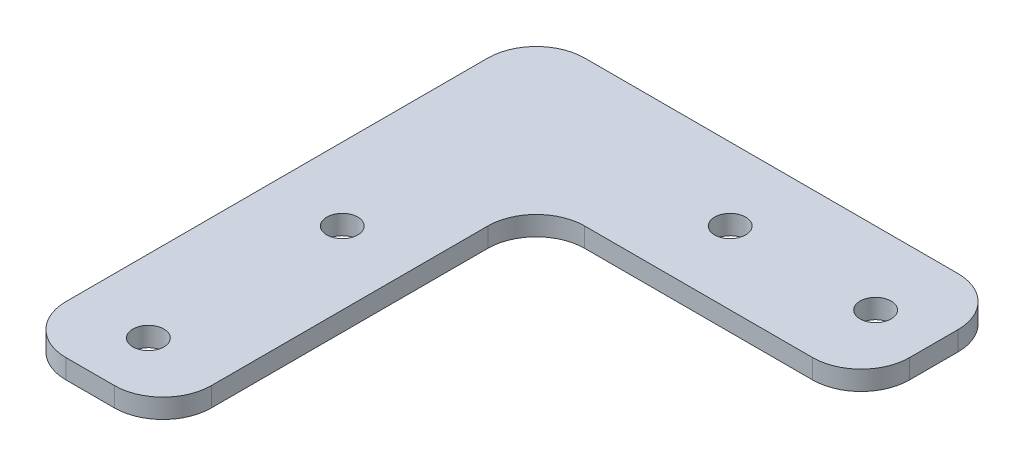
ISO-10303-21;
HEADER;
FILE_DESCRIPTION(('STEP AP214'),'2;1');
FILE_NAME('part.step','',(''),(''),'','','');
FILE_SCHEMA(('AUTOMOTIVE_DESIGN { 1 0 10303 214 1 1 1 1 }'));
ENDSEC;
DATA;
#1=APPLICATION_CONTEXT('core data for automotive mechanical design processes');
#2=APPLICATION_PROTOCOL_DEFINITION('international standard','automotive_design',2000,#1);
#3=PRODUCT_CONTEXT('',#1,'mechanical');
#4=PRODUCT('Part','Part','',(#3));
#5=PRODUCT_RELATED_PRODUCT_CATEGORY('part','',(#4));
#6=PRODUCT_DEFINITION_FORMATION('','',#4);
#7=PRODUCT_DEFINITION_CONTEXT('part definition',#1,'design');
#8=PRODUCT_DEFINITION('design','',#6,#7);
#9=PRODUCT_DEFINITION_SHAPE('','',#8);
#10=(LENGTH_UNIT() NAMED_UNIT(*) SI_UNIT(.MILLI.,.METRE.));
#11=(NAMED_UNIT(*) PLANE_ANGLE_UNIT() SI_UNIT($,.RADIAN.));
#12=(NAMED_UNIT(*) SI_UNIT($,.STERADIAN.) SOLID_ANGLE_UNIT());
#13=UNCERTAINTY_MEASURE_WITH_UNIT(LENGTH_MEASURE(1.E-05),#10,'distance_accuracy_value','');
#14=(GEOMETRIC_REPRESENTATION_CONTEXT(3) GLOBAL_UNCERTAINTY_ASSIGNED_CONTEXT((#13)) GLOBAL_UNIT_ASSIGNED_CONTEXT((#10,
#11,#12)) REPRESENTATION_CONTEXT('',''));
#15=CARTESIAN_POINT('',(0.,0.,0.));
#16=DIRECTION('',(0.,0.,1.));
#17=DIRECTION('',(1.,0.,0.));
#18=AXIS2_PLACEMENT_3D('',#15,#16,#17);
#19=CARTESIAN_POINT('',(0.,2.,0.));
#20=DIRECTION('',(0.,1.,0.));
#21=DIRECTION('',(0.,0.,1.));
#22=AXIS2_PLACEMENT_3D('',#19,#20,#21);
#23=PLANE('',#22);
#24=CARTESIAN_POINT('',(20.,2.,2.15105711021124E-13));
#25=DIRECTION('',(0.,1.,0.));
#26=DIRECTION('',(0.,0.,-1.));
#27=AXIS2_PLACEMENT_3D('',#24,#25,#26);
#28=CIRCLE('',#27,1.6);
#29=CARTESIAN_POINT('',(20.,2.,-1.59999999999979));
#30=VERTEX_POINT('',#29);
#31=EDGE_CURVE('E318',#30,#30,#28,.T.);
#32=ORIENTED_EDGE('',*,*,#31,.F.);
#33=EDGE_LOOP('',(#32));
#34=FACE_BOUND('',#33,.T.);
#35=CARTESIAN_POINT('',(0.,2.,40.));
#36=DIRECTION('',(0.,1.,0.));
#37=DIRECTION('',(0.,0.,1.));
#38=AXIS2_PLACEMENT_3D('',#35,#36,#37);
#39=CIRCLE('',#38,1.6);
#40=CARTESIAN_POINT('',(0.,2.,41.6));
#41=VERTEX_POINT('',#40);
#42=EDGE_CURVE('E292',#41,#41,#39,.T.);
#43=ORIENTED_EDGE('',*,*,#42,.F.);
#44=EDGE_LOOP('',(#43));
#45=FACE_BOUND('',#44,.T.);
#46=DIRECTION('',(1.,0.,0.));
#47=VECTOR('',#46,1.);
#48=CARTESIAN_POINT('',(7.5,2.,46.));
#49=LINE('',#48,#47);
#50=CARTESIAN_POINT('',(-2.5,2.,46.));
#51=VERTEX_POINT('',#50);
#52=CARTESIAN_POINT('',(2.5,2.,46.));
#53=VERTEX_POINT('',#52);
#54=EDGE_CURVE('E253',#51,#53,#49,.T.);
#55=ORIENTED_EDGE('',*,*,#54,.T.);
#56=CARTESIAN_POINT('',(2.5,2.,41.));
#57=DIRECTION('',(0.,1.,0.));
#58=DIRECTION('',(0.,0.,1.));
#59=AXIS2_PLACEMENT_3D('',#56,#57,#58);
#60=CIRCLE('',#59,5.);
#61=CARTESIAN_POINT('',(7.5,2.,41.));
#62=VERTEX_POINT('',#61);
#63=EDGE_CURVE('E212',#53,#62,#60,.T.);
#64=ORIENTED_EDGE('',*,*,#63,.T.);
#65=DIRECTION('',(0.,0.,-1.));
#66=VECTOR('',#65,1.);
#67=CARTESIAN_POINT('',(7.5,2.,7.50000000000007));
#68=LINE('',#67,#66);
#69=CARTESIAN_POINT('',(7.5,2.,12.5));
#70=VERTEX_POINT('',#69);
#71=EDGE_CURVE('E159',#62,#70,#68,.T.);
#72=ORIENTED_EDGE('',*,*,#71,.T.);
#73=CARTESIAN_POINT('',(12.5,2.,12.5));
#74=DIRECTION('',(0.,1.,0.));
#75=DIRECTION('',(0.,0.,1.));
#76=AXIS2_PLACEMENT_3D('',#73,#74,#75);
#77=CIRCLE('',#76,5.);
#78=CARTESIAN_POINT('',(12.5,2.,7.50000000000005));
#79=VERTEX_POINT('',#78);
#80=EDGE_CURVE('E11',#70,#79,#77,.F.);
#81=ORIENTED_EDGE('',*,*,#80,.T.);
#82=DIRECTION('',(1.,0.,0.));
#83=VECTOR('',#82,1.);
#84=CARTESIAN_POINT('',(7.5,2.,7.50000000000007));
#85=LINE('',#84,#83);
#86=CARTESIAN_POINT('',(36.,2.,7.49999999999994));
#87=VERTEX_POINT('',#86);
#88=EDGE_CURVE('E168',#79,#87,#85,.T.);
#89=ORIENTED_EDGE('',*,*,#88,.T.);
#90=CARTESIAN_POINT('',(36.,2.,2.49999999999994));
#91=DIRECTION('',(0.,1.,0.));
#92=DIRECTION('',(0.,0.,1.));
#93=AXIS2_PLACEMENT_3D('',#90,#91,#92);
#94=CIRCLE('',#93,5.);
#95=CARTESIAN_POINT('',(41.,2.,2.49999999999994));
#96=VERTEX_POINT('',#95);
#97=EDGE_CURVE('E201',#87,#96,#94,.T.);
#98=ORIENTED_EDGE('',*,*,#97,.T.);
#99=DIRECTION('',(0.,0.,-1.));
#100=VECTOR('',#99,1.);
#101=CARTESIAN_POINT('',(41.,2.,7.49999999999992));
#102=LINE('',#101,#100);
#103=CARTESIAN_POINT('',(41.,2.,-2.50000000000009));
#104=VERTEX_POINT('',#103);
#105=EDGE_CURVE('E177',#96,#104,#102,.T.);
#106=ORIENTED_EDGE('',*,*,#105,.T.);
#107=CARTESIAN_POINT('',(36.,2.,-2.50000000000008));
#108=DIRECTION('',(0.,1.,0.));
#109=DIRECTION('',(0.,0.,1.));
#110=AXIS2_PLACEMENT_3D('',#107,#108,#109);
#111=CIRCLE('',#110,5.);
#112=CARTESIAN_POINT('',(36.,2.,-7.50000000000008));
#113=VERTEX_POINT('',#112);
#114=EDGE_CURVE('E204',#104,#113,#111,.T.);
#115=ORIENTED_EDGE('',*,*,#114,.T.);
#116=DIRECTION('',(-1.,0.,0.));
#117=VECTOR('',#116,1.);
#118=CARTESIAN_POINT('',(41.,2.,-7.50000000000008));
#119=LINE('',#118,#117);
#120=CARTESIAN_POINT('',(-2.5,2.,-7.50000000000008));
#121=VERTEX_POINT('',#120);
#122=EDGE_CURVE('E262',#113,#121,#119,.T.);
#123=ORIENTED_EDGE('',*,*,#122,.T.);
#124=CARTESIAN_POINT('',(-2.5,2.,-2.50000000000008));
#125=DIRECTION('',(0.,1.,0.));
#126=DIRECTION('',(0.,0.,1.));
#127=AXIS2_PLACEMENT_3D('',#124,#125,#126);
#128=CIRCLE('',#127,5.);
#129=CARTESIAN_POINT('',(-7.5,2.,-2.50000000000008));
#130=VERTEX_POINT('',#129);
#131=EDGE_CURVE('E70',#121,#130,#128,.T.);
#132=ORIENTED_EDGE('',*,*,#131,.T.);
#133=DIRECTION('',(0.,0.,1.));
#134=VECTOR('',#133,1.);
#135=CARTESIAN_POINT('',(-7.5,2.,46.));
#136=LINE('',#135,#134);
#137=CARTESIAN_POINT('',(-7.5,2.,41.));
#138=VERTEX_POINT('',#137);
#139=EDGE_CURVE('E258',#130,#138,#136,.T.);
#140=ORIENTED_EDGE('',*,*,#139,.T.);
#141=CARTESIAN_POINT('',(-2.5,2.,41.));
#142=DIRECTION('',(0.,1.,0.));
#143=DIRECTION('',(0.,0.,1.));
#144=AXIS2_PLACEMENT_3D('',#141,#142,#143);
#145=CIRCLE('',#144,5.);
#146=EDGE_CURVE('E209',#138,#51,#145,.T.);
#147=ORIENTED_EDGE('',*,*,#146,.T.);
#148=EDGE_LOOP('',(#55,#64,#72,#81,#89,#98,#106,#115,#123,#132,#140,#147));
#149=FACE_BOUND('',#148,.T.);
#150=CARTESIAN_POINT('',(0.,2.,20.));
#151=DIRECTION('',(0.,1.,0.));
#152=DIRECTION('',(0.,0.,1.));
#153=AXIS2_PLACEMENT_3D('',#150,#151,#152);
#154=CIRCLE('',#153,1.6);
#155=CARTESIAN_POINT('',(0.,2.,21.6));
#156=VERTEX_POINT('',#155);
#157=EDGE_CURVE('E304',#156,#156,#154,.T.);
#158=ORIENTED_EDGE('',*,*,#157,.F.);
#159=EDGE_LOOP('',(#158));
#160=FACE_BOUND('',#159,.T.);
#161=CARTESIAN_POINT('',(35.,2.,1.83880688453542E-13));
#162=DIRECTION('',(0.,1.,0.));
#163=DIRECTION('',(0.,0.,-1.));
#164=AXIS2_PLACEMENT_3D('',#161,#162,#163);
#165=CIRCLE('',#164,1.6);
#166=CARTESIAN_POINT('',(35.,2.,-1.59999999999981));
#167=VERTEX_POINT('',#166);
#168=EDGE_CURVE('E328',#167,#167,#165,.T.);
#169=ORIENTED_EDGE('',*,*,#168,.F.);
#170=EDGE_LOOP('',(#169));
#171=FACE_BOUND('',#170,.T.);
#172=ADVANCED_FACE('F47',(#34,#45,#149,#160,#171),#23,.T.);
#173=CARTESIAN_POINT('',(0.,0.,0.));
#174=DIRECTION('',(0.,1.,0.));
#175=DIRECTION('',(0.,0.,1.));
#176=AXIS2_PLACEMENT_3D('',#173,#174,#175);
#177=PLANE('',#176);
#178=DIRECTION('',(0.,0.,-1.));
#179=VECTOR('',#178,1.);
#180=CARTESIAN_POINT('',(7.5,0.,7.50000000000007));
#181=LINE('',#180,#179);
#182=CARTESIAN_POINT('',(7.5,0.,41.));
#183=VERTEX_POINT('',#182);
#184=CARTESIAN_POINT('',(7.5,0.,12.5));
#185=VERTEX_POINT('',#184);
#186=EDGE_CURVE('E156',#183,#185,#181,.T.);
#187=ORIENTED_EDGE('',*,*,#186,.F.);
#188=CARTESIAN_POINT('',(2.5,0.,41.));
#189=DIRECTION('',(0.,1.,0.));
#190=DIRECTION('',(0.,0.,1.));
#191=AXIS2_PLACEMENT_3D('',#188,#189,#190);
#192=CIRCLE('',#191,5.);
#193=CARTESIAN_POINT('',(2.5,0.,46.));
#194=VERTEX_POINT('',#193);
#195=EDGE_CURVE('E138',#183,#194,#192,.F.);
#196=ORIENTED_EDGE('',*,*,#195,.T.);
#197=DIRECTION('',(1.,0.,0.));
#198=VECTOR('',#197,1.);
#199=CARTESIAN_POINT('',(7.5,0.,46.));
#200=LINE('',#199,#198);
#201=CARTESIAN_POINT('',(-2.5,0.,46.));
#202=VERTEX_POINT('',#201);
#203=EDGE_CURVE('E169',#202,#194,#200,.T.);
#204=ORIENTED_EDGE('',*,*,#203,.F.);
#205=CARTESIAN_POINT('',(-2.5,0.,41.));
#206=DIRECTION('',(0.,1.,0.));
#207=DIRECTION('',(0.,0.,1.));
#208=AXIS2_PLACEMENT_3D('',#205,#206,#207);
#209=CIRCLE('',#208,5.);
#210=CARTESIAN_POINT('',(-7.5,0.,41.));
#211=VERTEX_POINT('',#210);
#212=EDGE_CURVE('E150',#202,#211,#209,.F.);
#213=ORIENTED_EDGE('',*,*,#212,.T.);
#214=DIRECTION('',(0.,0.,1.));
#215=VECTOR('',#214,1.);
#216=CARTESIAN_POINT('',(-7.5,0.,46.));
#217=LINE('',#216,#215);
#218=CARTESIAN_POINT('',(-7.5,0.,-2.50000000000008));
#219=VERTEX_POINT('',#218);
#220=EDGE_CURVE('E180',#219,#211,#217,.T.);
#221=ORIENTED_EDGE('',*,*,#220,.F.);
#222=CARTESIAN_POINT('',(-2.5,0.,-2.50000000000008));
#223=DIRECTION('',(0.,1.,0.));
#224=DIRECTION('',(0.,0.,1.));
#225=AXIS2_PLACEMENT_3D('',#222,#223,#224);
#226=CIRCLE('',#225,5.);
#227=CARTESIAN_POINT('',(-2.5,0.,-7.50000000000008));
#228=VERTEX_POINT('',#227);
#229=EDGE_CURVE('E191',#219,#228,#226,.F.);
#230=ORIENTED_EDGE('',*,*,#229,.T.);
#231=DIRECTION('',(-1.,0.,0.));
#232=VECTOR('',#231,1.);
#233=CARTESIAN_POINT('',(41.,0.,-7.50000000000008));
#234=LINE('',#233,#232);
#235=CARTESIAN_POINT('',(36.,0.,-7.50000000000008));
#236=VERTEX_POINT('',#235);
#237=EDGE_CURVE('E278',#236,#228,#234,.T.);
#238=ORIENTED_EDGE('',*,*,#237,.F.);
#239=CARTESIAN_POINT('',(36.,0.,-2.50000000000008));
#240=DIRECTION('',(0.,1.,0.));
#241=DIRECTION('',(0.,0.,1.));
#242=AXIS2_PLACEMENT_3D('',#239,#240,#241);
#243=CIRCLE('',#242,5.);
#244=CARTESIAN_POINT('',(41.,0.,-2.50000000000009));
#245=VERTEX_POINT('',#244);
#246=EDGE_CURVE('E188',#236,#245,#243,.F.);
#247=ORIENTED_EDGE('',*,*,#246,.T.);
#248=DIRECTION('',(0.,0.,-1.));
#249=VECTOR('',#248,1.);
#250=CARTESIAN_POINT('',(41.,0.,7.49999999999992));
#251=LINE('',#250,#249);
#252=CARTESIAN_POINT('',(41.,0.,2.49999999999994));
#253=VERTEX_POINT('',#252);
#254=EDGE_CURVE('E283',#253,#245,#251,.T.);
#255=ORIENTED_EDGE('',*,*,#254,.F.);
#256=CARTESIAN_POINT('',(36.,0.,2.49999999999994));
#257=DIRECTION('',(0.,1.,0.));
#258=DIRECTION('',(0.,0.,1.));
#259=AXIS2_PLACEMENT_3D('',#256,#257,#258);
#260=CIRCLE('',#259,5.);
#261=CARTESIAN_POINT('',(36.,0.,7.49999999999994));
#262=VERTEX_POINT('',#261);
#263=EDGE_CURVE('E161',#253,#262,#260,.F.);
#264=ORIENTED_EDGE('',*,*,#263,.T.);
#265=DIRECTION('',(1.,0.,0.));
#266=VECTOR('',#265,1.);
#267=CARTESIAN_POINT('',(7.5,0.,7.50000000000007));
#268=LINE('',#267,#266);
#269=CARTESIAN_POINT('',(12.5,0.,7.50000000000005));
#270=VERTEX_POINT('',#269);
#271=EDGE_CURVE('E288',#270,#262,#268,.T.);
#272=ORIENTED_EDGE('',*,*,#271,.F.);
#273=CARTESIAN_POINT('',(12.5,0.,12.5));
#274=DIRECTION('',(0.,1.,0.));
#275=DIRECTION('',(0.,0.,1.));
#276=AXIS2_PLACEMENT_3D('',#273,#274,#275);
#277=CIRCLE('',#276,5.);
#278=EDGE_CURVE('E56',#270,#185,#277,.T.);
#279=ORIENTED_EDGE('',*,*,#278,.T.);
#280=EDGE_LOOP('',(#187,#196,#204,#213,#221,#230,#238,#247,#255,#264,#272,#279));
#281=FACE_BOUND('',#280,.T.);
#282=CARTESIAN_POINT('',(0.,0.,40.));
#283=DIRECTION('',(0.,1.,0.));
#284=DIRECTION('',(0.,0.,1.));
#285=AXIS2_PLACEMENT_3D('',#282,#283,#284);
#286=CIRCLE('',#285,1.6);
#287=CARTESIAN_POINT('',(0.,0.,41.6));
#288=VERTEX_POINT('',#287);
#289=EDGE_CURVE('E298',#288,#288,#286,.T.);
#290=ORIENTED_EDGE('',*,*,#289,.T.);
#291=EDGE_LOOP('',(#290));
#292=FACE_BOUND('',#291,.T.);
#293=CARTESIAN_POINT('',(0.,0.,20.));
#294=DIRECTION('',(0.,1.,0.));
#295=DIRECTION('',(0.,0.,1.));
#296=AXIS2_PLACEMENT_3D('',#293,#294,#295);
#297=CIRCLE('',#296,1.6);
#298=CARTESIAN_POINT('',(0.,0.,21.6));
#299=VERTEX_POINT('',#298);
#300=EDGE_CURVE('E312',#299,#299,#297,.T.);
#301=ORIENTED_EDGE('',*,*,#300,.T.);
#302=EDGE_LOOP('',(#301));
#303=FACE_BOUND('',#302,.T.);
#304=CARTESIAN_POINT('',(20.,0.,2.15105711021124E-13));
#305=DIRECTION('',(0.,1.,0.));
#306=DIRECTION('',(0.,0.,-1.));
#307=AXIS2_PLACEMENT_3D('',#304,#305,#306);
#308=CIRCLE('',#307,1.6);
#309=CARTESIAN_POINT('',(20.,0.,-1.59999999999979));
#310=VERTEX_POINT('',#309);
#311=EDGE_CURVE('E323',#310,#310,#308,.T.);
#312=ORIENTED_EDGE('',*,*,#311,.T.);
#313=EDGE_LOOP('',(#312));
#314=FACE_BOUND('',#313,.T.);
#315=CARTESIAN_POINT('',(35.,0.,1.83880688453542E-13));
#316=DIRECTION('',(0.,1.,0.));
#317=DIRECTION('',(0.,0.,-1.));
#318=AXIS2_PLACEMENT_3D('',#315,#316,#317);
#319=CIRCLE('',#318,1.6);
#320=CARTESIAN_POINT('',(35.,0.,-1.59999999999981));
#321=VERTEX_POINT('',#320);
#322=EDGE_CURVE('E333',#321,#321,#319,.T.);
#323=ORIENTED_EDGE('',*,*,#322,.T.);
#324=EDGE_LOOP('',(#323));
#325=FACE_BOUND('',#324,.T.);
#326=ADVANCED_FACE('F164',(#281,#292,#303,#314,#325),#177,.F.);
#327=CARTESIAN_POINT('',(7.5,2.,7.50000000000007));
#328=DIRECTION('',(0.,0.,-1.));
#329=DIRECTION('',(-1.,0.,0.));
#330=AXIS2_PLACEMENT_3D('',#327,#328,#329);
#331=PLANE('',#330);
#332=ORIENTED_EDGE('',*,*,#271,.T.);
#333=DIRECTION('',(0.,-1.,0.));
#334=VECTOR('',#333,1.);
#335=CARTESIAN_POINT('',(36.,2.,7.49999999999994));
#336=LINE('',#335,#334);
#337=EDGE_CURVE('E239',#262,#87,#336,.F.);
#338=ORIENTED_EDGE('',*,*,#337,.T.);
#339=ORIENTED_EDGE('',*,*,#88,.F.);
#340=DIRECTION('',(0.,-1.,0.));
#341=VECTOR('',#340,1.);
#342=CARTESIAN_POINT('',(12.5,0.,7.50000000000005));
#343=LINE('',#342,#341);
#344=EDGE_CURVE('E235',#79,#270,#343,.T.);
#345=ORIENTED_EDGE('',*,*,#344,.T.);
#346=EDGE_LOOP('',(#332,#338,#339,#345));
#347=FACE_BOUND('',#346,.T.);
#348=ADVANCED_FACE('F362',(#347),#331,.F.);
#349=CARTESIAN_POINT('',(41.,2.,7.49999999999992));
#350=DIRECTION('',(-1.,0.,0.));
#351=DIRECTION('',(0.,0.,1.));
#352=AXIS2_PLACEMENT_3D('',#349,#350,#351);
#353=PLANE('',#352);
#354=ORIENTED_EDGE('',*,*,#254,.T.);
#355=DIRECTION('',(0.,-1.,0.));
#356=VECTOR('',#355,1.);
#357=CARTESIAN_POINT('',(41.,2.,-2.50000000000009));
#358=LINE('',#357,#356);
#359=EDGE_CURVE('E232',#245,#104,#358,.F.);
#360=ORIENTED_EDGE('',*,*,#359,.T.);
#361=ORIENTED_EDGE('',*,*,#105,.F.);
#362=DIRECTION('',(0.,-1.,0.));
#363=VECTOR('',#362,1.);
#364=CARTESIAN_POINT('',(41.,2.,2.49999999999994));
#365=LINE('',#364,#363);
#366=EDGE_CURVE('E228',#96,#253,#365,.T.);
#367=ORIENTED_EDGE('',*,*,#366,.T.);
#368=EDGE_LOOP('',(#354,#360,#361,#367));
#369=FACE_BOUND('',#368,.T.);
#370=ADVANCED_FACE('F381',(#369),#353,.F.);
#371=CARTESIAN_POINT('',(41.,2.,-7.50000000000008));
#372=DIRECTION('',(0.,0.,1.));
#373=DIRECTION('',(1.,0.,0.));
#374=AXIS2_PLACEMENT_3D('',#371,#372,#373);
#375=PLANE('',#374);
#376=ORIENTED_EDGE('',*,*,#237,.T.);
#377=DIRECTION('',(0.,-1.,0.));
#378=VECTOR('',#377,1.);
#379=CARTESIAN_POINT('',(-2.5,2.,-7.50000000000008));
#380=LINE('',#379,#378);
#381=EDGE_CURVE('E225',#228,#121,#380,.F.);
#382=ORIENTED_EDGE('',*,*,#381,.T.);
#383=ORIENTED_EDGE('',*,*,#122,.F.);
#384=DIRECTION('',(0.,-1.,0.));
#385=VECTOR('',#384,1.);
#386=CARTESIAN_POINT('',(36.,2.,-7.50000000000008));
#387=LINE('',#386,#385);
#388=EDGE_CURVE('E221',#113,#236,#387,.T.);
#389=ORIENTED_EDGE('',*,*,#388,.T.);
#390=EDGE_LOOP('',(#376,#382,#383,#389));
#391=FACE_BOUND('',#390,.T.);
#392=ADVANCED_FACE('F378',(#391),#375,.F.);
#393=CARTESIAN_POINT('',(-7.5,2.,46.));
#394=DIRECTION('',(1.,0.,0.));
#395=DIRECTION('',(0.,0.,-1.));
#396=AXIS2_PLACEMENT_3D('',#393,#394,#395);
#397=PLANE('',#396);
#398=ORIENTED_EDGE('',*,*,#220,.T.);
#399=DIRECTION('',(0.,-1.,0.));
#400=VECTOR('',#399,1.);
#401=CARTESIAN_POINT('',(-7.5,2.,41.));
#402=LINE('',#401,#400);
#403=EDGE_CURVE('E63',#211,#138,#402,.F.);
#404=ORIENTED_EDGE('',*,*,#403,.T.);
#405=ORIENTED_EDGE('',*,*,#139,.F.);
#406=DIRECTION('',(0.,-1.,0.));
#407=VECTOR('',#406,1.);
#408=CARTESIAN_POINT('',(-7.5,2.,-2.50000000000008));
#409=LINE('',#408,#407);
#410=EDGE_CURVE('E215',#130,#219,#409,.T.);
#411=ORIENTED_EDGE('',*,*,#410,.T.);
#412=EDGE_LOOP('',(#398,#404,#405,#411));
#413=FACE_BOUND('',#412,.T.);
#414=ADVANCED_FACE('F375',(#413),#397,.F.);
#415=CARTESIAN_POINT('',(7.5,2.,46.));
#416=DIRECTION('',(0.,0.,-1.));
#417=DIRECTION('',(-1.,0.,0.));
#418=AXIS2_PLACEMENT_3D('',#415,#416,#417);
#419=PLANE('',#418);
#420=ORIENTED_EDGE('',*,*,#203,.T.);
#421=DIRECTION('',(0.,-1.,0.));
#422=VECTOR('',#421,1.);
#423=CARTESIAN_POINT('',(2.5,2.,46.));
#424=LINE('',#423,#422);
#425=EDGE_CURVE('E143',#194,#53,#424,.F.);
#426=ORIENTED_EDGE('',*,*,#425,.T.);
#427=ORIENTED_EDGE('',*,*,#54,.F.);
#428=DIRECTION('',(0.,-1.,0.));
#429=VECTOR('',#428,1.);
#430=CARTESIAN_POINT('',(-2.5,2.,46.));
#431=LINE('',#430,#429);
#432=EDGE_CURVE('E149',#51,#202,#431,.T.);
#433=ORIENTED_EDGE('',*,*,#432,.T.);
#434=EDGE_LOOP('',(#420,#426,#427,#433));
#435=FACE_BOUND('',#434,.T.);
#436=ADVANCED_FACE('F372',(#435),#419,.F.);
#437=CARTESIAN_POINT('',(7.5,2.,7.50000000000007));
#438=DIRECTION('',(-1.,0.,0.));
#439=DIRECTION('',(0.,0.,1.));
#440=AXIS2_PLACEMENT_3D('',#437,#438,#439);
#441=PLANE('',#440);
#442=ORIENTED_EDGE('',*,*,#71,.F.);
#443=DIRECTION('',(0.,-1.,0.));
#444=VECTOR('',#443,1.);
#445=CARTESIAN_POINT('',(7.5,2.,41.));
#446=LINE('',#445,#444);
#447=EDGE_CURVE('E142',#62,#183,#446,.T.);
#448=ORIENTED_EDGE('',*,*,#447,.T.);
#449=ORIENTED_EDGE('',*,*,#186,.T.);
#450=DIRECTION('',(0.,-1.,0.));
#451=VECTOR('',#450,1.);
#452=CARTESIAN_POINT('',(7.5,2.,12.5));
#453=LINE('',#452,#451);
#454=EDGE_CURVE('E162',#185,#70,#453,.F.);
#455=ORIENTED_EDGE('',*,*,#454,.T.);
#456=EDGE_LOOP('',(#442,#448,#449,#455));
#457=FACE_BOUND('',#456,.T.);
#458=ADVANCED_FACE('F155',(#457),#441,.F.);
#459=CARTESIAN_POINT('',(0.,2.,40.));
#460=DIRECTION('',(0.,-1.,0.));
#461=DIRECTION('',(0.,0.,-1.));
#462=AXIS2_PLACEMENT_3D('',#459,#460,#461);
#463=CYLINDRICAL_SURFACE('',#462,1.6);
#464=ORIENTED_EDGE('',*,*,#42,.T.);
#465=EDGE_LOOP('',(#464));
#466=FACE_BOUND('',#465,.T.);
#467=ORIENTED_EDGE('',*,*,#289,.F.);
#468=EDGE_LOOP('',(#467));
#469=FACE_BOUND('',#468,.T.);
#470=ADVANCED_FACE('F367',(#466,#469),#463,.F.);
#471=CARTESIAN_POINT('',(0.,2.,20.));
#472=DIRECTION('',(0.,-1.,0.));
#473=DIRECTION('',(0.,0.,-1.));
#474=AXIS2_PLACEMENT_3D('',#471,#472,#473);
#475=CYLINDRICAL_SURFACE('',#474,1.6);
#476=ORIENTED_EDGE('',*,*,#157,.T.);
#477=EDGE_LOOP('',(#476));
#478=FACE_BOUND('',#477,.T.);
#479=ORIENTED_EDGE('',*,*,#300,.F.);
#480=EDGE_LOOP('',(#479));
#481=FACE_BOUND('',#480,.T.);
#482=ADVANCED_FACE('F353',(#478,#481),#475,.F.);
#483=CARTESIAN_POINT('',(20.,2.,2.15105711021124E-13));
#484=DIRECTION('',(0.,-1.,0.));
#485=DIRECTION('',(0.,0.,-1.));
#486=AXIS2_PLACEMENT_3D('',#483,#484,#485);
#487=CYLINDRICAL_SURFACE('',#486,1.6);
#488=ORIENTED_EDGE('',*,*,#31,.T.);
#489=EDGE_LOOP('',(#488));
#490=FACE_BOUND('',#489,.T.);
#491=ORIENTED_EDGE('',*,*,#311,.F.);
#492=EDGE_LOOP('',(#491));
#493=FACE_BOUND('',#492,.T.);
#494=ADVANCED_FACE('F344',(#490,#493),#487,.F.);
#495=CARTESIAN_POINT('',(35.,2.,1.83880688453542E-13));
#496=DIRECTION('',(0.,-1.,0.));
#497=DIRECTION('',(0.,0.,-1.));
#498=AXIS2_PLACEMENT_3D('',#495,#496,#497);
#499=CYLINDRICAL_SURFACE('',#498,1.6);
#500=ORIENTED_EDGE('',*,*,#168,.T.);
#501=EDGE_LOOP('',(#500));
#502=FACE_BOUND('',#501,.T.);
#503=ORIENTED_EDGE('',*,*,#322,.F.);
#504=EDGE_LOOP('',(#503));
#505=FACE_BOUND('',#504,.T.);
#506=ADVANCED_FACE('F342',(#502,#505),#499,.F.);
#507=CARTESIAN_POINT('',(2.5,2.,41.));
#508=DIRECTION('',(0.,-1.,0.));
#509=DIRECTION('',(0.,0.,-1.));
#510=AXIS2_PLACEMENT_3D('',#507,#508,#509);
#511=CYLINDRICAL_SURFACE('',#510,5.);
#512=ORIENTED_EDGE('',*,*,#63,.F.);
#513=ORIENTED_EDGE('',*,*,#425,.F.);
#514=ORIENTED_EDGE('',*,*,#195,.F.);
#515=ORIENTED_EDGE('',*,*,#447,.F.);
#516=EDGE_LOOP('',(#512,#513,#514,#515));
#517=FACE_BOUND('',#516,.T.);
#518=ADVANCED_FACE('F141',(#517),#511,.T.);
#519=CARTESIAN_POINT('',(-2.5,2.,41.));
#520=DIRECTION('',(0.,-1.,0.));
#521=DIRECTION('',(0.,0.,-1.));
#522=AXIS2_PLACEMENT_3D('',#519,#520,#521);
#523=CYLINDRICAL_SURFACE('',#522,5.);
#524=ORIENTED_EDGE('',*,*,#146,.F.);
#525=ORIENTED_EDGE('',*,*,#403,.F.);
#526=ORIENTED_EDGE('',*,*,#212,.F.);
#527=ORIENTED_EDGE('',*,*,#432,.F.);
#528=EDGE_LOOP('',(#524,#525,#526,#527));
#529=FACE_BOUND('',#528,.T.);
#530=ADVANCED_FACE('F351',(#529),#523,.T.);
#531=CARTESIAN_POINT('',(-2.5,2.,-2.50000000000008));
#532=DIRECTION('',(0.,-1.,0.));
#533=DIRECTION('',(0.,0.,-1.));
#534=AXIS2_PLACEMENT_3D('',#531,#532,#533);
#535=CYLINDRICAL_SURFACE('',#534,5.);
#536=ORIENTED_EDGE('',*,*,#131,.F.);
#537=ORIENTED_EDGE('',*,*,#381,.F.);
#538=ORIENTED_EDGE('',*,*,#229,.F.);
#539=ORIENTED_EDGE('',*,*,#410,.F.);
#540=EDGE_LOOP('',(#536,#537,#538,#539));
#541=FACE_BOUND('',#540,.T.);
#542=ADVANCED_FACE('F390',(#541),#535,.T.);
#543=CARTESIAN_POINT('',(36.,2.,-2.50000000000008));
#544=DIRECTION('',(0.,-1.,0.));
#545=DIRECTION('',(0.,0.,-1.));
#546=AXIS2_PLACEMENT_3D('',#543,#544,#545);
#547=CYLINDRICAL_SURFACE('',#546,5.);
#548=ORIENTED_EDGE('',*,*,#114,.F.);
#549=ORIENTED_EDGE('',*,*,#359,.F.);
#550=ORIENTED_EDGE('',*,*,#246,.F.);
#551=ORIENTED_EDGE('',*,*,#388,.F.);
#552=EDGE_LOOP('',(#548,#549,#550,#551));
#553=FACE_BOUND('',#552,.T.);
#554=ADVANCED_FACE('F394',(#553),#547,.T.);
#555=CARTESIAN_POINT('',(36.,2.,2.49999999999994));
#556=DIRECTION('',(0.,-1.,0.));
#557=DIRECTION('',(0.,0.,-1.));
#558=AXIS2_PLACEMENT_3D('',#555,#556,#557);
#559=CYLINDRICAL_SURFACE('',#558,5.);
#560=ORIENTED_EDGE('',*,*,#97,.F.);
#561=ORIENTED_EDGE('',*,*,#337,.F.);
#562=ORIENTED_EDGE('',*,*,#263,.F.);
#563=ORIENTED_EDGE('',*,*,#366,.F.);
#564=EDGE_LOOP('',(#560,#561,#562,#563));
#565=FACE_BOUND('',#564,.T.);
#566=ADVANCED_FACE('F397',(#565),#559,.T.);
#567=CARTESIAN_POINT('',(12.5,2.,12.5));
#568=DIRECTION('',(0.,1.,0.));
#569=DIRECTION('',(0.,0.,1.));
#570=AXIS2_PLACEMENT_3D('',#567,#568,#569);
#571=CYLINDRICAL_SURFACE('',#570,5.);
#572=ORIENTED_EDGE('',*,*,#80,.F.);
#573=ORIENTED_EDGE('',*,*,#454,.F.);
#574=ORIENTED_EDGE('',*,*,#278,.F.);
#575=ORIENTED_EDGE('',*,*,#344,.F.);
#576=EDGE_LOOP('',(#572,#573,#574,#575));
#577=FACE_BOUND('',#576,.T.);
#578=ADVANCED_FACE('F49',(#577),#571,.F.);
#579=CLOSED_SHELL('',(#172,#326,#348,#370,#392,#414,#436,#458,#470,#482,#494,#506,#518,#530,
#542,#554,#566,#578));
#580=MANIFOLD_SOLID_BREP('B2',#579);
#581=ADVANCED_BREP_SHAPE_REPRESENTATION('',(#18,#580),#14);
#582=SHAPE_DEFINITION_REPRESENTATION(#9,#581);
ENDSEC;
END-ISO-10303-21;
